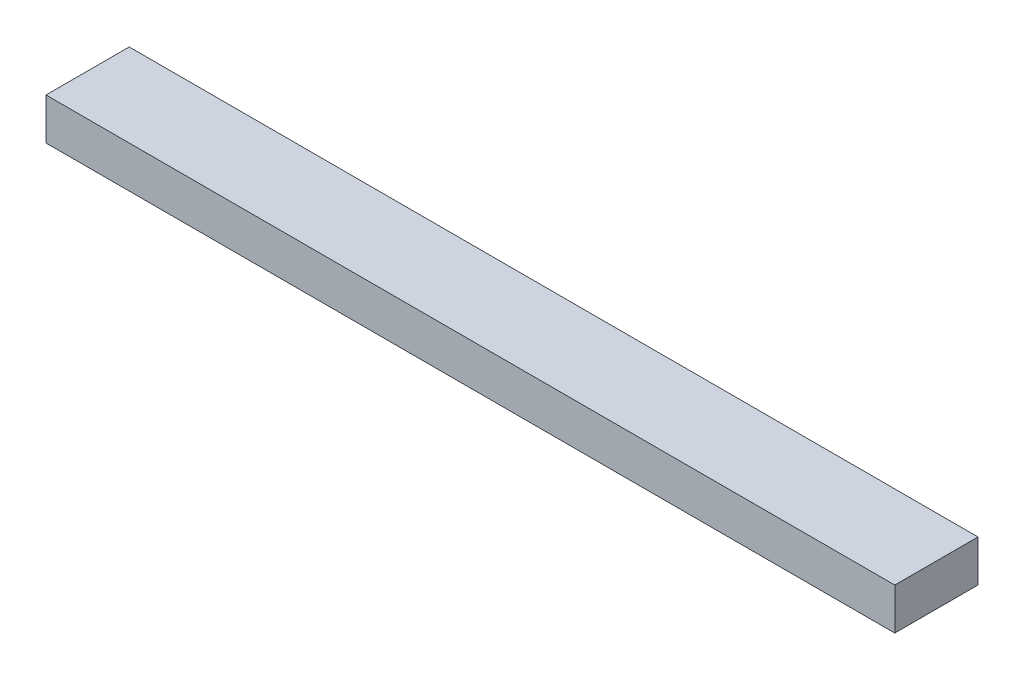
ISO-10303-21;
HEADER;
FILE_DESCRIPTION(('STEP AP214'),'2;1');
FILE_NAME('part.step','',(''),(''),'','','');
FILE_SCHEMA(('AUTOMOTIVE_DESIGN { 1 0 10303 214 1 1 1 1 }'));
ENDSEC;
DATA;
#1=APPLICATION_CONTEXT('core data for automotive mechanical design processes');
#2=APPLICATION_PROTOCOL_DEFINITION('international standard','automotive_design',2000,#1);
#3=PRODUCT_CONTEXT('',#1,'mechanical');
#4=PRODUCT('Part','Part','',(#3));
#5=PRODUCT_RELATED_PRODUCT_CATEGORY('part','',(#4));
#6=PRODUCT_DEFINITION_FORMATION('','',#4);
#7=PRODUCT_DEFINITION_CONTEXT('part definition',#1,'design');
#8=PRODUCT_DEFINITION('design','',#6,#7);
#9=PRODUCT_DEFINITION_SHAPE('','',#8);
#10=(LENGTH_UNIT() NAMED_UNIT(*) SI_UNIT(.MILLI.,.METRE.));
#11=(NAMED_UNIT(*) PLANE_ANGLE_UNIT() SI_UNIT($,.RADIAN.));
#12=(NAMED_UNIT(*) SI_UNIT($,.STERADIAN.) SOLID_ANGLE_UNIT());
#13=UNCERTAINTY_MEASURE_WITH_UNIT(LENGTH_MEASURE(1.E-05),#10,'distance_accuracy_value','');
#14=(GEOMETRIC_REPRESENTATION_CONTEXT(3) GLOBAL_UNCERTAINTY_ASSIGNED_CONTEXT((#13)) GLOBAL_UNIT_ASSIGNED_CONTEXT((#10,
#11,#12)) REPRESENTATION_CONTEXT('',''));
#15=CARTESIAN_POINT('',(0.,0.,0.));
#16=DIRECTION('',(0.,0.,1.));
#17=DIRECTION('',(1.,0.,0.));
#18=AXIS2_PLACEMENT_3D('',#15,#16,#17);
#19=CARTESIAN_POINT('',(0.,5.,10.));
#20=DIRECTION('',(1.,0.,0.));
#21=DIRECTION('',(0.,0.,-1.));
#22=AXIS2_PLACEMENT_3D('',#19,#20,#21);
#23=PLANE('',#22);
#24=DIRECTION('',(0.,0.,1.));
#25=VECTOR('',#24,1.);
#26=CARTESIAN_POINT('',(0.,0.,10.));
#27=LINE('',#26,#25);
#28=CARTESIAN_POINT('',(0.,0.,0.));
#29=VERTEX_POINT('',#28);
#30=CARTESIAN_POINT('',(0.,0.,10.));
#31=VERTEX_POINT('',#30);
#32=EDGE_CURVE('E98',#29,#31,#27,.T.);
#33=ORIENTED_EDGE('',*,*,#32,.T.);
#34=DIRECTION('',(0.,-1.,0.));
#35=VECTOR('',#34,1.);
#36=CARTESIAN_POINT('',(0.,5.,10.));
#37=LINE('',#36,#35);
#38=CARTESIAN_POINT('',(0.,5.,10.));
#39=VERTEX_POINT('',#38);
#40=EDGE_CURVE('E11',#39,#31,#37,.T.);
#41=ORIENTED_EDGE('',*,*,#40,.F.);
#42=DIRECTION('',(0.,0.,1.));
#43=VECTOR('',#42,1.);
#44=CARTESIAN_POINT('',(0.,5.,10.));
#45=LINE('',#44,#43);
#46=CARTESIAN_POINT('',(0.,5.,0.));
#47=VERTEX_POINT('',#46);
#48=EDGE_CURVE('E86',#47,#39,#45,.T.);
#49=ORIENTED_EDGE('',*,*,#48,.F.);
#50=DIRECTION('',(0.,-1.,0.));
#51=VECTOR('',#50,1.);
#52=CARTESIAN_POINT('',(0.,5.,0.));
#53=LINE('',#52,#51);
#54=EDGE_CURVE('E94',#47,#29,#53,.T.);
#55=ORIENTED_EDGE('',*,*,#54,.T.);
#56=EDGE_LOOP('',(#33,#41,#49,#55));
#57=FACE_BOUND('',#56,.T.);
#58=ADVANCED_FACE('F35',(#57),#23,.F.);
#59=CARTESIAN_POINT('',(101.987252731619,5.,10.));
#60=DIRECTION('',(0.,0.,-1.));
#61=DIRECTION('',(-1.,0.,0.));
#62=AXIS2_PLACEMENT_3D('',#59,#60,#61);
#63=PLANE('',#62);
#64=DIRECTION('',(1.,0.,0.));
#65=VECTOR('',#64,1.);
#66=CARTESIAN_POINT('',(101.987252731619,0.,10.));
#67=LINE('',#66,#65);
#68=CARTESIAN_POINT('',(101.987252731619,0.,10.));
#69=VERTEX_POINT('',#68);
#70=EDGE_CURVE('E90',#31,#69,#67,.T.);
#71=ORIENTED_EDGE('',*,*,#70,.T.);
#72=DIRECTION('',(0.,-1.,0.));
#73=VECTOR('',#72,1.);
#74=CARTESIAN_POINT('',(101.987252731619,5.,10.));
#75=LINE('',#74,#73);
#76=CARTESIAN_POINT('',(101.987252731619,5.,10.));
#77=VERTEX_POINT('',#76);
#78=EDGE_CURVE('E43',#77,#69,#75,.T.);
#79=ORIENTED_EDGE('',*,*,#78,.F.);
#80=DIRECTION('',(1.,0.,0.));
#81=VECTOR('',#80,1.);
#82=CARTESIAN_POINT('',(101.987252731619,5.,10.));
#83=LINE('',#82,#81);
#84=EDGE_CURVE('E81',#39,#77,#83,.T.);
#85=ORIENTED_EDGE('',*,*,#84,.F.);
#86=ORIENTED_EDGE('',*,*,#40,.T.);
#87=EDGE_LOOP('',(#71,#79,#85,#86));
#88=FACE_BOUND('',#87,.T.);
#89=ADVANCED_FACE('F89',(#88),#63,.F.);
#90=CARTESIAN_POINT('',(101.987252731619,5.,0.));
#91=DIRECTION('',(-1.,0.,0.));
#92=DIRECTION('',(0.,0.,1.));
#93=AXIS2_PLACEMENT_3D('',#90,#91,#92);
#94=PLANE('',#93);
#95=DIRECTION('',(0.,0.,-1.));
#96=VECTOR('',#95,1.);
#97=CARTESIAN_POINT('',(101.987252731619,0.,0.));
#98=LINE('',#97,#96);
#99=CARTESIAN_POINT('',(101.987252731619,0.,0.));
#100=VERTEX_POINT('',#99);
#101=EDGE_CURVE('E68',#69,#100,#98,.T.);
#102=ORIENTED_EDGE('',*,*,#101,.T.);
#103=DIRECTION('',(0.,-1.,0.));
#104=VECTOR('',#103,1.);
#105=CARTESIAN_POINT('',(101.987252731619,5.,0.));
#106=LINE('',#105,#104);
#107=CARTESIAN_POINT('',(101.987252731619,5.,0.));
#108=VERTEX_POINT('',#107);
#109=EDGE_CURVE('E91',#108,#100,#106,.T.);
#110=ORIENTED_EDGE('',*,*,#109,.F.);
#111=DIRECTION('',(0.,0.,-1.));
#112=VECTOR('',#111,1.);
#113=CARTESIAN_POINT('',(101.987252731619,5.,0.));
#114=LINE('',#113,#112);
#115=EDGE_CURVE('E84',#77,#108,#114,.T.);
#116=ORIENTED_EDGE('',*,*,#115,.F.);
#117=ORIENTED_EDGE('',*,*,#78,.T.);
#118=EDGE_LOOP('',(#102,#110,#116,#117));
#119=FACE_BOUND('',#118,.T.);
#120=ADVANCED_FACE('F92',(#119),#94,.F.);
#121=CARTESIAN_POINT('',(0.,5.,0.));
#122=DIRECTION('',(0.,0.,1.));
#123=DIRECTION('',(1.,0.,0.));
#124=AXIS2_PLACEMENT_3D('',#121,#122,#123);
#125=PLANE('',#124);
#126=DIRECTION('',(-1.,0.,0.));
#127=VECTOR('',#126,1.);
#128=CARTESIAN_POINT('',(0.,0.,0.));
#129=LINE('',#128,#127);
#130=EDGE_CURVE('E74',#100,#29,#129,.T.);
#131=ORIENTED_EDGE('',*,*,#130,.T.);
#132=ORIENTED_EDGE('',*,*,#54,.F.);
#133=DIRECTION('',(-1.,0.,0.));
#134=VECTOR('',#133,1.);
#135=CARTESIAN_POINT('',(0.,5.,0.));
#136=LINE('',#135,#134);
#137=EDGE_CURVE('E51',#108,#47,#136,.T.);
#138=ORIENTED_EDGE('',*,*,#137,.F.);
#139=ORIENTED_EDGE('',*,*,#109,.T.);
#140=EDGE_LOOP('',(#131,#132,#138,#139));
#141=FACE_BOUND('',#140,.T.);
#142=ADVANCED_FACE('F105',(#141),#125,.F.);
#143=CARTESIAN_POINT('',(0.,5.,0.));
#144=DIRECTION('',(0.,-1.,0.));
#145=DIRECTION('',(0.,0.,-1.));
#146=AXIS2_PLACEMENT_3D('',#143,#144,#145);
#147=PLANE('',#146);
#148=ORIENTED_EDGE('',*,*,#48,.T.);
#149=ORIENTED_EDGE('',*,*,#84,.T.);
#150=ORIENTED_EDGE('',*,*,#115,.T.);
#151=ORIENTED_EDGE('',*,*,#137,.T.);
#152=EDGE_LOOP('',(#148,#149,#150,#151));
#153=FACE_BOUND('',#152,.T.);
#154=ADVANCED_FACE('F82',(#153),#147,.F.);
#155=CARTESIAN_POINT('',(0.,0.,0.));
#156=DIRECTION('',(0.,-1.,0.));
#157=DIRECTION('',(0.,0.,-1.));
#158=AXIS2_PLACEMENT_3D('',#155,#156,#157);
#159=PLANE('',#158);
#160=ORIENTED_EDGE('',*,*,#32,.F.);
#161=ORIENTED_EDGE('',*,*,#130,.F.);
#162=ORIENTED_EDGE('',*,*,#101,.F.);
#163=ORIENTED_EDGE('',*,*,#70,.F.);
#164=EDGE_LOOP('',(#160,#161,#162,#163));
#165=FACE_BOUND('',#164,.T.);
#166=ADVANCED_FACE('F108',(#165),#159,.T.);
#167=CLOSED_SHELL('',(#58,#89,#120,#142,#154,#166));
#168=MANIFOLD_SOLID_BREP('B2',#167);
#169=ADVANCED_BREP_SHAPE_REPRESENTATION('',(#18,#168),#14);
#170=SHAPE_DEFINITION_REPRESENTATION(#9,#169);
ENDSEC;
END-ISO-10303-21;
